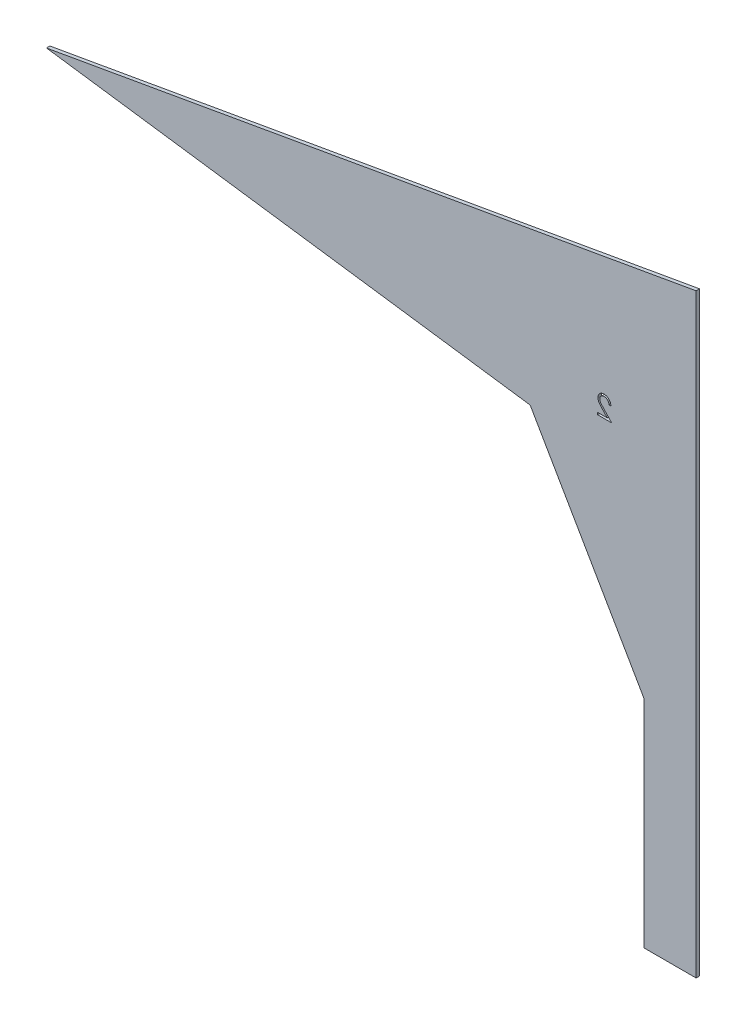
ISO-10303-21;
HEADER;
FILE_DESCRIPTION(('STEP AP214'),'2;1');
FILE_NAME('part.step','',(''),(''),'','','');
FILE_SCHEMA(('AUTOMOTIVE_DESIGN { 1 0 10303 214 1 1 1 1 }'));
ENDSEC;
DATA;
#1=APPLICATION_CONTEXT('core data for automotive mechanical design processes');
#2=APPLICATION_PROTOCOL_DEFINITION('international standard','automotive_design',2000,#1);
#3=PRODUCT_CONTEXT('',#1,'mechanical');
#4=PRODUCT('Part','Part','',(#3));
#5=PRODUCT_RELATED_PRODUCT_CATEGORY('part','',(#4));
#6=PRODUCT_DEFINITION_FORMATION('','',#4);
#7=PRODUCT_DEFINITION_CONTEXT('part definition',#1,'design');
#8=PRODUCT_DEFINITION('design','',#6,#7);
#9=PRODUCT_DEFINITION_SHAPE('','',#8);
#10=(LENGTH_UNIT() NAMED_UNIT(*) SI_UNIT(.MILLI.,.METRE.));
#11=(NAMED_UNIT(*) PLANE_ANGLE_UNIT() SI_UNIT($,.RADIAN.));
#12=(NAMED_UNIT(*) SI_UNIT($,.STERADIAN.) SOLID_ANGLE_UNIT());
#13=UNCERTAINTY_MEASURE_WITH_UNIT(LENGTH_MEASURE(1.E-05),#10,'distance_accuracy_value','');
#14=(GEOMETRIC_REPRESENTATION_CONTEXT(3) GLOBAL_UNCERTAINTY_ASSIGNED_CONTEXT((#13)) GLOBAL_UNIT_ASSIGNED_CONTEXT((#10,
#11,#12)) REPRESENTATION_CONTEXT('',''));
#15=CARTESIAN_POINT('',(0.,0.,0.));
#16=DIRECTION('',(0.,0.,1.));
#17=DIRECTION('',(1.,0.,0.));
#18=AXIS2_PLACEMENT_3D('',#15,#16,#17);
#19=CARTESIAN_POINT('',(-30.4074432347773,218.44830431483,-701.675));
#20=CARTESIAN_POINT('',(-30.418585596149,218.675113003966,-701.675));
#21=CARTESIAN_POINT('',(-30.4404688973478,219.120559233295,-701.675));
#22=CARTESIAN_POINT('',(-30.5429485860438,219.770022209553,-701.675));
#23=CARTESIAN_POINT('',(-30.6895839319732,220.39080618547,-701.675));
#24=CARTESIAN_POINT('',(-30.8969102745395,220.977926717219,-701.675));
#25=CARTESIAN_POINT('',(-31.1543915864007,221.536575082287,-701.675));
#26=CARTESIAN_POINT('',(-31.4631650211452,222.06453231055,-701.675));
#27=CARTESIAN_POINT('',(-31.8288915503683,222.559784351982,-701.675));
#28=CARTESIAN_POINT('',(-32.2436739171012,223.017740056204,-701.675));
#29=CARTESIAN_POINT('',(-32.6941717953863,223.43786097727,-701.675));
#30=CARTESIAN_POINT('',(-33.1802512659359,223.800655941686,-701.675));
#31=CARTESIAN_POINT('',(-33.6910363430227,224.107184981527,-701.675));
#32=CARTESIAN_POINT('',(-34.2249773573915,224.363441454883,-701.675));
#33=CARTESIAN_POINT('',(-34.7880984247651,224.55579118769,-701.675));
#34=CARTESIAN_POINT('',(-35.3752894081484,224.698511826109,-701.675));
#35=CARTESIAN_POINT('',(-35.9891301363198,224.784380222108,-701.675));
#36=CARTESIAN_POINT('',(-36.4073593991752,224.793610140897,-701.675));
#37=CARTESIAN_POINT('',(-36.620063427085,224.79830431483,-701.675));
#38=B_SPLINE_CURVE_WITH_KNOTS('',3,(#19,#20,#21,#22,#23,#24,#25,#26,#27,#28,#29,#30,#31,#32,#33,
#34,#35,#36,#37),.UNSPECIFIED.,.F.,.F.,(4,1,1,1,1,1,1,1,1,1,1,1,1,1,1,1,4),(0.,
0.0687907943906173,0.135103289431127,0.198978674310652,0.261904299780856,0.323494969367969,
0.385195377966051,0.446969238740774,0.509764776703132,0.572250568847369,0.633405175661153,
0.693251162921752,0.75258316278567,0.812579266153421,0.873275084920192,0.93554994289503,1.),.UNSPECIFIED.);
#39=DIRECTION('',(0.,0.,1.));
#40=VECTOR('',#39,1.);
#41=SURFACE_OF_LINEAR_EXTRUSION('',#38,#40);
#42=DIRECTION('',(0.,0.,-1.));
#43=VECTOR('',#42,1.);
#44=CARTESIAN_POINT('',(-30.4074432347773,218.44830431483,-701.675));
#45=LINE('',#44,#43);
#46=CARTESIAN_POINT('',(-30.4074432347773,218.44830431483,-698.5));
#47=VERTEX_POINT('',#46);
#48=CARTESIAN_POINT('',(-30.4074432347773,218.44830431483,-701.675));
#49=VERTEX_POINT('',#48);
#50=EDGE_CURVE('E11',#47,#49,#45,.T.);
#51=ORIENTED_EDGE('',*,*,#50,.F.);
#52=CARTESIAN_POINT('',(-30.4074432347773,218.44830431483,-698.5));
#53=CARTESIAN_POINT('',(-30.418585596149,218.675113003966,-698.5));
#54=CARTESIAN_POINT('',(-30.4404688973478,219.120559233295,-698.5));
#55=CARTESIAN_POINT('',(-30.5429485860438,219.770022209553,-698.5));
#56=CARTESIAN_POINT('',(-30.6895839319732,220.39080618547,-698.5));
#57=CARTESIAN_POINT('',(-30.8969102745395,220.977926717219,-698.5));
#58=CARTESIAN_POINT('',(-31.1543915864007,221.536575082287,-698.5));
#59=CARTESIAN_POINT('',(-31.4631650211452,222.06453231055,-698.5));
#60=CARTESIAN_POINT('',(-31.8288915503683,222.559784351982,-698.5));
#61=CARTESIAN_POINT('',(-32.2436739171012,223.017740056204,-698.5));
#62=CARTESIAN_POINT('',(-32.6941717953863,223.43786097727,-698.5));
#63=CARTESIAN_POINT('',(-33.1802512659359,223.800655941686,-698.5));
#64=CARTESIAN_POINT('',(-33.6910363430227,224.107184981527,-698.5));
#65=CARTESIAN_POINT('',(-34.2249773573915,224.363441454883,-698.5));
#66=CARTESIAN_POINT('',(-34.7880984247651,224.55579118769,-698.5));
#67=CARTESIAN_POINT('',(-35.3752894081484,224.698511826109,-698.5));
#68=CARTESIAN_POINT('',(-35.9891301363198,224.784380222108,-698.5));
#69=CARTESIAN_POINT('',(-36.4073593991752,224.793610140897,-698.5));
#70=CARTESIAN_POINT('',(-36.620063427085,224.79830431483,-698.5));
#71=B_SPLINE_CURVE_WITH_KNOTS('',3,(#52,#53,#54,#55,#56,#57,#58,#59,#60,#61,#62,#63,#64,#65,#66,
#67,#68,#69,#70),.UNSPECIFIED.,.F.,.F.,(4,1,1,1,1,1,1,1,1,1,1,1,1,1,1,1,4),(0.,
0.0687907943906173,0.135103289431127,0.198978674310652,0.261904299780856,0.323494969367969,
0.385195377966051,0.446969238740774,0.509764776703132,0.572250568847369,0.633405175661153,
0.693251162921752,0.75258316278567,0.812579266153421,0.873275084920192,0.93554994289503,1.),.UNSPECIFIED.);
#72=CARTESIAN_POINT('',(-36.620063427085,224.79830431483,-698.5));
#73=VERTEX_POINT('',#72);
#74=EDGE_CURVE('E151',#47,#73,#71,.T.);
#75=ORIENTED_EDGE('',*,*,#74,.T.);
#76=DIRECTION('',(0.,0.,-1.));
#77=VECTOR('',#76,1.);
#78=CARTESIAN_POINT('',(-36.620063427085,224.79830431483,-701.675));
#79=LINE('',#78,#77);
#80=CARTESIAN_POINT('',(-36.620063427085,224.79830431483,-701.675));
#81=VERTEX_POINT('',#80);
#82=EDGE_CURVE('E62',#73,#81,#79,.T.);
#83=ORIENTED_EDGE('',*,*,#82,.T.);
#84=EDGE_CURVE('E296',#49,#81,#38,.T.);
#85=ORIENTED_EDGE('',*,*,#84,.F.);
#86=EDGE_LOOP('',(#51,#75,#83,#85));
#87=FACE_BOUND('',#86,.T.);
#88=ADVANCED_FACE('F51',(#87),#41,.F.);
#89=CARTESIAN_POINT('',(-36.620063427085,224.79830431483,-701.675));
#90=CARTESIAN_POINT('',(-36.8289498017604,224.793414144749,-701.675));
#91=CARTESIAN_POINT('',(-37.2394040662474,224.783805135223,-701.675));
#92=CARTESIAN_POINT('',(-37.8384558877696,224.701285818783,-701.675));
#93=CARTESIAN_POINT('',(-38.4087437333488,224.572041955739,-701.675));
#94=CARTESIAN_POINT('',(-38.9491528625609,224.390710904091,-701.675));
#95=CARTESIAN_POINT('',(-39.4553715854415,224.146955663569,-701.675));
#96=CARTESIAN_POINT('',(-39.9312027279554,223.854143346015,-701.675));
#97=CARTESIAN_POINT('',(-40.382311140975,223.515489692404,-701.675));
#98=CARTESIAN_POINT('',(-40.788385206064,223.116779650635,-701.675));
#99=CARTESIAN_POINT('',(-41.1612648944785,222.691135243732,-701.675));
#100=CARTESIAN_POINT('',(-41.4829500260495,222.236722511214,-701.675));
#101=CARTESIAN_POINT('',(-41.7584302443829,221.767388827537,-701.675));
#102=CARTESIAN_POINT('',(-41.9880517591647,221.279555330357,-701.675));
#103=CARTESIAN_POINT('',(-42.1570858868191,220.768628732854,-701.675));
#104=CARTESIAN_POINT('',(-42.2854187048075,220.242047529088,-701.675));
#105=CARTESIAN_POINT('',(-42.3579579135956,219.694361057752,-701.675));
#106=CARTESIAN_POINT('',(-42.3690908614911,219.32366680487,-701.675));
#107=CARTESIAN_POINT('',(-42.374750927085,219.135203353292,-701.675));
#108=B_SPLINE_CURVE_WITH_KNOTS('',3,(#89,#90,#91,#92,#93,#94,#95,#96,#97,#98,#99,#100,#101,#102,
#103,#104,#105,#106,#107),.UNSPECIFIED.,.F.,.F.,(4,1,1,1,1,1,1,1,1,1,1,1,1,1,1,1,4),(0.,
0.0694754602496707,0.136516797617799,0.200788823609261,0.263829672855826,0.32573502296542,
0.38729069221529,0.449509218762602,0.512967819545442,0.57627521549306,0.637580100263924,
0.697902605917102,0.757172088426984,0.816598528488654,0.876653170892819,0.93728964241024,1.),.UNSPECIFIED.);
#109=DIRECTION('',(0.,0.,1.));
#110=VECTOR('',#109,1.);
#111=SURFACE_OF_LINEAR_EXTRUSION('',#108,#110);
#112=ORIENTED_EDGE('',*,*,#82,.F.);
#113=CARTESIAN_POINT('',(-36.620063427085,224.79830431483,-698.5));
#114=CARTESIAN_POINT('',(-36.8289498017604,224.793414144749,-698.5));
#115=CARTESIAN_POINT('',(-37.2394040662474,224.783805135223,-698.5));
#116=CARTESIAN_POINT('',(-37.8384558877696,224.701285818783,-698.5));
#117=CARTESIAN_POINT('',(-38.4087437333488,224.572041955739,-698.5));
#118=CARTESIAN_POINT('',(-38.9491528625609,224.390710904091,-698.5));
#119=CARTESIAN_POINT('',(-39.4553715854415,224.146955663569,-698.5));
#120=CARTESIAN_POINT('',(-39.9312027279554,223.854143346015,-698.5));
#121=CARTESIAN_POINT('',(-40.382311140975,223.515489692404,-698.5));
#122=CARTESIAN_POINT('',(-40.788385206064,223.116779650635,-698.5));
#123=CARTESIAN_POINT('',(-41.1612648944785,222.691135243732,-698.5));
#124=CARTESIAN_POINT('',(-41.4829500260495,222.236722511214,-698.5));
#125=CARTESIAN_POINT('',(-41.7584302443829,221.767388827537,-698.5));
#126=CARTESIAN_POINT('',(-41.9880517591647,221.279555330357,-698.5));
#127=CARTESIAN_POINT('',(-42.1570858868191,220.768628732854,-698.5));
#128=CARTESIAN_POINT('',(-42.2854187048075,220.242047529088,-698.5));
#129=CARTESIAN_POINT('',(-42.3579579135956,219.694361057752,-698.5));
#130=CARTESIAN_POINT('',(-42.3690908614911,219.32366680487,-698.5));
#131=CARTESIAN_POINT('',(-42.374750927085,219.135203353292,-698.5));
#132=B_SPLINE_CURVE_WITH_KNOTS('',3,(#113,#114,#115,#116,#117,#118,#119,#120,#121,#122,#123,
#124,#125,#126,#127,#128,#129,#130,#131),.UNSPECIFIED.,.F.,.F.,(4,1,1,1,1,1,1,1,1,1,1,1,1,1,1,1,
4),(0.,0.0694754602496707,0.136516797617799,0.200788823609261,0.263829672855826,
0.32573502296542,0.38729069221529,0.449509218762602,0.512967819545442,0.57627521549306,
0.637580100263924,0.697902605917102,0.757172088426984,0.816598528488654,0.876653170892819,
0.93728964241024,1.),.UNSPECIFIED.);
#133=CARTESIAN_POINT('',(-42.374750927085,219.135203353292,-698.5));
#134=VERTEX_POINT('',#133);
#135=EDGE_CURVE('E215',#73,#134,#132,.T.);
#136=ORIENTED_EDGE('',*,*,#135,.T.);
#137=DIRECTION('',(0.,0.,-1.));
#138=VECTOR('',#137,1.);
#139=CARTESIAN_POINT('',(-42.374750927085,219.135203353292,-701.675));
#140=LINE('',#139,#138);
#141=CARTESIAN_POINT('',(-42.374750927085,219.135203353292,-701.675));
#142=VERTEX_POINT('',#141);
#143=EDGE_CURVE('E287',#134,#142,#140,.T.);
#144=ORIENTED_EDGE('',*,*,#143,.T.);
#145=EDGE_CURVE('E305',#81,#142,#108,.T.);
#146=ORIENTED_EDGE('',*,*,#145,.F.);
#147=EDGE_LOOP('',(#112,#136,#144,#146));
#148=FACE_BOUND('',#147,.T.);
#149=ADVANCED_FACE('F309',(#148),#111,.F.);
#150=CARTESIAN_POINT('',(-42.374750927085,219.135203353292,-701.675));
#151=CARTESIAN_POINT('',(-42.3655347392519,218.869875853677,-701.675));
#152=CARTESIAN_POINT('',(-42.3472640946337,218.343876976413,-701.675));
#153=CARTESIAN_POINT('',(-42.190975845031,217.570910366307,-701.675));
#154=CARTESIAN_POINT('',(-41.946882691783,216.822009042421,-701.675));
#155=CARTESIAN_POINT('',(-41.6529827923601,216.21928172679,-701.675));
#156=CARTESIAN_POINT('',(-41.3564970611101,215.733596567913,-701.675));
#157=CARTESIAN_POINT('',(-41.0893207697789,215.333716902564,-701.675));
#158=CARTESIAN_POINT('',(-40.7765480126459,214.903157138901,-701.675));
#159=CARTESIAN_POINT('',(-40.4136264737348,214.443359059766,-701.675));
#160=CARTESIAN_POINT('',(-40.0080635553143,213.950721133444,-701.675));
#161=CARTESIAN_POINT('',(-39.5561857804732,213.425540961347,-701.675));
#162=CARTESIAN_POINT('',(-39.0547708283282,212.873244614183,-701.675));
#163=CARTESIAN_POINT('',(-38.702843845651,212.496024126629,-701.675));
#164=CARTESIAN_POINT('',(-38.5204841001619,212.300557920599,-701.675));
#165=B_SPLINE_CURVE_WITH_KNOTS('',3,(#150,#151,#152,#153,#154,#155,#156,#157,#158,#159,#160,
#161,#162,#163,#164),.UNSPECIFIED.,.F.,.F.,(4,1,1,1,1,1,1,1,1,1,1,1,4),(0.,0.0987021963061504,
0.195672308810662,0.292422426507954,0.391342543799823,0.44446244067189,0.504228775449315,
0.570352337994677,0.642545753097748,0.722287505344017,0.807921122682712,0.900469537985015,1.),.UNSPECIFIED.);
#166=DIRECTION('',(0.,0.,1.));
#167=VECTOR('',#166,1.);
#168=SURFACE_OF_LINEAR_EXTRUSION('',#165,#167);
#169=ORIENTED_EDGE('',*,*,#143,.F.);
#170=CARTESIAN_POINT('',(-42.374750927085,219.135203353292,-698.5));
#171=CARTESIAN_POINT('',(-42.3655347392519,218.869875853677,-698.5));
#172=CARTESIAN_POINT('',(-42.3472640946337,218.343876976413,-698.5));
#173=CARTESIAN_POINT('',(-42.190975845031,217.570910366307,-698.5));
#174=CARTESIAN_POINT('',(-41.946882691783,216.822009042421,-698.5));
#175=CARTESIAN_POINT('',(-41.6529827923601,216.21928172679,-698.5));
#176=CARTESIAN_POINT('',(-41.3564970611101,215.733596567913,-698.5));
#177=CARTESIAN_POINT('',(-41.0893207697789,215.333716902564,-698.5));
#178=CARTESIAN_POINT('',(-40.7765480126459,214.903157138901,-698.5));
#179=CARTESIAN_POINT('',(-40.4136264737348,214.443359059766,-698.5));
#180=CARTESIAN_POINT('',(-40.0080635553143,213.950721133444,-698.5));
#181=CARTESIAN_POINT('',(-39.5561857804732,213.425540961347,-698.5));
#182=CARTESIAN_POINT('',(-39.0547708283282,212.873244614183,-698.5));
#183=CARTESIAN_POINT('',(-38.702843845651,212.496024126629,-698.5));
#184=CARTESIAN_POINT('',(-38.5204841001619,212.300557920599,-698.5));
#185=B_SPLINE_CURVE_WITH_KNOTS('',3,(#170,#171,#172,#173,#174,#175,#176,#177,#178,#179,#180,
#181,#182,#183,#184),.UNSPECIFIED.,.F.,.F.,(4,1,1,1,1,1,1,1,1,1,1,1,4),(0.,0.0987021963061504,
0.195672308810662,0.292422426507954,0.391342543799823,0.44446244067189,0.504228775449315,
0.570352337994677,0.642545753097748,0.722287505344017,0.807921122682712,0.900469537985015,1.),.UNSPECIFIED.);
#186=CARTESIAN_POINT('',(-38.5204841001619,212.300557920599,-698.5));
#187=VERTEX_POINT('',#186);
#188=EDGE_CURVE('E209',#134,#187,#185,.T.);
#189=ORIENTED_EDGE('',*,*,#188,.T.);
#190=DIRECTION('',(0.,0.,-1.));
#191=VECTOR('',#190,1.);
#192=CARTESIAN_POINT('',(-38.5204841001619,212.300557920599,-701.675));
#193=LINE('',#192,#191);
#194=CARTESIAN_POINT('',(-38.5204841001619,212.300557920599,-701.675));
#195=VERTEX_POINT('',#194);
#196=EDGE_CURVE('E283',#187,#195,#193,.T.);
#197=ORIENTED_EDGE('',*,*,#196,.T.);
#198=EDGE_CURVE('E311',#142,#195,#165,.T.);
#199=ORIENTED_EDGE('',*,*,#198,.F.);
#200=EDGE_LOOP('',(#169,#189,#197,#199));
#201=FACE_BOUND('',#200,.T.);
#202=ADVANCED_FACE('F333',(#201),#168,.F.);
#203=CARTESIAN_POINT('',(-38.5204841001619,212.300557920599,-701.675));
#204=DIRECTION('',(-0.729724964678344,-0.683740795861406,0.));
#205=DIRECTION('',(0.683740795861406,-0.729724964678344,0.));
#206=AXIS2_PLACEMENT_3D('',#203,#204,#205);
#207=PLANE('',#206);
#208=ORIENTED_EDGE('',*,*,#196,.F.);
#209=DIRECTION('',(0.683740795861406,-0.729724964678344,0.));
#210=VECTOR('',#209,1.);
#211=CARTESIAN_POINT('',(-38.5204841001619,212.300557920599,-698.5));
#212=LINE('',#211,#210);
#213=CARTESIAN_POINT('',(-33.7541679943927,207.213688930215,-698.5));
#214=VERTEX_POINT('',#213);
#215=EDGE_CURVE('E205',#187,#214,#212,.T.);
#216=ORIENTED_EDGE('',*,*,#215,.T.);
#217=DIRECTION('',(0.,0.,-1.));
#218=VECTOR('',#217,1.);
#219=CARTESIAN_POINT('',(-33.7541679943927,207.213688930215,-701.675));
#220=LINE('',#219,#218);
#221=CARTESIAN_POINT('',(-33.7541679943927,207.213688930215,-701.675));
#222=VERTEX_POINT('',#221);
#223=EDGE_CURVE('E279',#214,#222,#220,.T.);
#224=ORIENTED_EDGE('',*,*,#223,.T.);
#225=DIRECTION('',(0.683740795861406,-0.729724964678344,0.));
#226=VECTOR('',#225,1.);
#227=CARTESIAN_POINT('',(-38.5204841001619,212.300557920599,-701.675));
#228=LINE('',#227,#226);
#229=EDGE_CURVE('E314',#195,#222,#228,.T.);
#230=ORIENTED_EDGE('',*,*,#229,.F.);
#231=EDGE_LOOP('',(#208,#216,#224,#230));
#232=FACE_BOUND('',#231,.T.);
#233=ADVANCED_FACE('F354',(#232),#207,.F.);
#234=CARTESIAN_POINT('',(-33.7541679943927,207.213688930215,-701.675));
#235=DIRECTION('',(0.,1.,0.));
#236=DIRECTION('',(-1.,0.,0.));
#237=AXIS2_PLACEMENT_3D('',#234,#235,#236);
#238=PLANE('',#237);
#239=ORIENTED_EDGE('',*,*,#223,.F.);
#240=DIRECTION('',(1.,0.,0.));
#241=VECTOR('',#240,1.);
#242=CARTESIAN_POINT('',(0.,207.213688930215,-698.5));
#243=LINE('',#242,#241);
#244=CARTESIAN_POINT('',(-42.6189816963158,207.213688930215,-698.5));
#245=VERTEX_POINT('',#244);
#246=EDGE_CURVE('E201',#214,#245,#243,.F.);
#247=ORIENTED_EDGE('',*,*,#246,.T.);
#248=DIRECTION('',(0.,0.,-1.));
#249=VECTOR('',#248,1.);
#250=CARTESIAN_POINT('',(-42.6189816963158,207.213688930215,-701.675));
#251=LINE('',#250,#249);
#252=CARTESIAN_POINT('',(-42.6189816963158,207.213688930215,-701.675));
#253=VERTEX_POINT('',#252);
#254=EDGE_CURVE('E275',#245,#253,#251,.T.);
#255=ORIENTED_EDGE('',*,*,#254,.T.);
#256=DIRECTION('',(-1.,0.,0.));
#257=VECTOR('',#256,1.);
#258=CARTESIAN_POINT('',(-33.7541679943927,207.213688930215,-701.675));
#259=LINE('',#258,#257);
#260=EDGE_CURVE('E620',#222,#253,#259,.T.);
#261=ORIENTED_EDGE('',*,*,#260,.F.);
#262=EDGE_LOOP('',(#239,#247,#255,#261));
#263=FACE_BOUND('',#262,.T.);
#264=ADVANCED_FACE('F362',(#263),#238,.F.);
#265=CARTESIAN_POINT('',(-42.6189816963158,207.213688930215,-701.675));
#266=DIRECTION('',(-1.,0.,0.));
#267=DIRECTION('',(0.,-1.,0.));
#268=AXIS2_PLACEMENT_3D('',#265,#266,#267);
#269=PLANE('',#268);
#270=ORIENTED_EDGE('',*,*,#254,.F.);
#271=DIRECTION('',(0.,1.,0.));
#272=VECTOR('',#271,1.);
#273=CARTESIAN_POINT('',(-42.6189816963158,0.,-698.5));
#274=LINE('',#273,#272);
#275=CARTESIAN_POINT('',(-42.6189816963158,205.259842776369,-698.5));
#276=VERTEX_POINT('',#275);
#277=EDGE_CURVE('E197',#245,#276,#274,.F.);
#278=ORIENTED_EDGE('',*,*,#277,.T.);
#279=DIRECTION('',(0.,0.,-1.));
#280=VECTOR('',#279,1.);
#281=CARTESIAN_POINT('',(-42.6189816963158,205.259842776369,-701.675));
#282=LINE('',#281,#280);
#283=CARTESIAN_POINT('',(-42.6189816963158,205.259842776369,-701.675));
#284=VERTEX_POINT('',#283);
#285=EDGE_CURVE('E271',#276,#284,#282,.T.);
#286=ORIENTED_EDGE('',*,*,#285,.T.);
#287=DIRECTION('',(0.,-1.,0.));
#288=VECTOR('',#287,1.);
#289=CARTESIAN_POINT('',(-42.6189816963158,207.213688930215,-701.675));
#290=LINE('',#289,#288);
#291=EDGE_CURVE('E617',#253,#284,#290,.T.);
#292=ORIENTED_EDGE('',*,*,#291,.F.);
#293=EDGE_LOOP('',(#270,#278,#286,#292));
#294=FACE_BOUND('',#293,.T.);
#295=ADVANCED_FACE('F370',(#294),#269,.F.);
#296=CARTESIAN_POINT('',(-42.6189816963158,205.259842776369,-701.675));
#297=DIRECTION('',(0.,-1.,0.));
#298=DIRECTION('',(1.,0.,0.));
#299=AXIS2_PLACEMENT_3D('',#296,#297,#298);
#300=PLANE('',#299);
#301=ORIENTED_EDGE('',*,*,#285,.F.);
#302=DIRECTION('',(1.,0.,0.));
#303=VECTOR('',#302,1.);
#304=CARTESIAN_POINT('',(0.,205.259842776369,-698.5));
#305=LINE('',#304,#303);
#306=CARTESIAN_POINT('',(-29.674750927085,205.259842776369,-698.5));
#307=VERTEX_POINT('',#306);
#308=EDGE_CURVE('E193',#276,#307,#305,.T.);
#309=ORIENTED_EDGE('',*,*,#308,.T.);
#310=DIRECTION('',(0.,0.,-1.));
#311=VECTOR('',#310,1.);
#312=CARTESIAN_POINT('',(-29.674750927085,205.259842776369,-701.675));
#313=LINE('',#312,#311);
#314=CARTESIAN_POINT('',(-29.674750927085,205.259842776369,-701.675));
#315=VERTEX_POINT('',#314);
#316=EDGE_CURVE('E267',#307,#315,#313,.T.);
#317=ORIENTED_EDGE('',*,*,#316,.T.);
#318=DIRECTION('',(1.,0.,0.));
#319=VECTOR('',#318,1.);
#320=CARTESIAN_POINT('',(-42.6189816963158,205.259842776369,-701.675));
#321=LINE('',#320,#319);
#322=EDGE_CURVE('E574',#284,#315,#321,.T.);
#323=ORIENTED_EDGE('',*,*,#322,.F.);
#324=EDGE_LOOP('',(#301,#309,#317,#323));
#325=FACE_BOUND('',#324,.T.);
#326=ADVANCED_FACE('F379',(#325),#300,.F.);
#327=CARTESIAN_POINT('',(-29.674750927085,205.259842776369,-701.675));
#328=DIRECTION('',(0.729691385153424,0.683776631973393,0.));
#329=DIRECTION('',(-0.683776631973393,0.729691385153424,0.));
#330=AXIS2_PLACEMENT_3D('',#327,#328,#329);
#331=PLANE('',#330);
#332=ORIENTED_EDGE('',*,*,#316,.F.);
#333=DIRECTION('',(-0.683776631973393,0.729691385153424,0.));
#334=VECTOR('',#333,1.);
#335=CARTESIAN_POINT('',(-29.674750927085,205.259842776369,-698.5));
#336=LINE('',#335,#334);
#337=CARTESIAN_POINT('',(-37.0627316963158,213.143917295599,-698.5));
#338=VERTEX_POINT('',#337);
#339=EDGE_CURVE('E186',#307,#338,#336,.T.);
#340=ORIENTED_EDGE('',*,*,#339,.T.);
#341=DIRECTION('',(0.,0.,-1.));
#342=VECTOR('',#341,1.);
#343=CARTESIAN_POINT('',(-37.0627316963158,213.143917295599,-701.675));
#344=LINE('',#343,#342);
#345=CARTESIAN_POINT('',(-37.0627316963158,213.143917295599,-701.675));
#346=VERTEX_POINT('',#345);
#347=EDGE_CURVE('E263',#338,#346,#344,.T.);
#348=ORIENTED_EDGE('',*,*,#347,.T.);
#349=DIRECTION('',(-0.683776631973393,0.729691385153424,0.));
#350=VECTOR('',#349,1.);
#351=CARTESIAN_POINT('',(-29.674750927085,205.259842776369,-701.675));
#352=LINE('',#351,#350);
#353=EDGE_CURVE('E564',#315,#346,#352,.T.);
#354=ORIENTED_EDGE('',*,*,#353,.F.);
#355=EDGE_LOOP('',(#332,#340,#348,#354));
#356=FACE_BOUND('',#355,.T.);
#357=ADVANCED_FACE('F388',(#356),#331,.F.);
#358=CARTESIAN_POINT('',(-37.0627316963158,213.143917295599,-701.675));
#359=CARTESIAN_POINT('',(-37.2426066230842,213.331686649814,-701.675));
#360=CARTESIAN_POINT('',(-37.5881095449743,213.692353151188,-701.675));
#361=CARTESIAN_POINT('',(-38.0767832844644,214.218911262775,-701.675));
#362=CARTESIAN_POINT('',(-38.5156897779933,214.707405191726,-701.675));
#363=CARTESIAN_POINT('',(-38.9076701586514,215.156911976831,-701.675));
#364=CARTESIAN_POINT('',(-39.2442210949996,215.574006652975,-701.675));
#365=CARTESIAN_POINT('',(-39.5428828146011,215.945180682502,-701.675000000001));
#366=CARTESIAN_POINT('',(-39.7821812455178,216.286744190607,-701.675));
#367=CARTESIAN_POINT('',(-40.0418893277607,216.682660960617,-701.675));
#368=CARTESIAN_POINT('',(-40.2934254265139,217.166053715521,-701.675));
#369=CARTESIAN_POINT('',(-40.509574107248,217.756787081356,-701.675));
#370=CARTESIAN_POINT('',(-40.6413720680898,218.364902556635,-701.675));
#371=CARTESIAN_POINT('',(-40.6571826727715,218.775849358278,-701.675));
#372=CARTESIAN_POINT('',(-40.6651355424696,218.982559122522,-701.675));
#373=B_SPLINE_CURVE_WITH_KNOTS('',3,(#358,#359,#360,#361,#362,#363,#364,#365,#366,#367,#368,
#369,#370,#371,#372),.UNSPECIFIED.,.F.,.F.,(4,1,1,1,1,1,1,1,1,1,1,1,4),(0.,0.110802643801319,
0.212829202347771,0.306101309823113,0.39064732111601,0.466924469360852,0.53448103928403,
0.593586940965673,0.644557004508716,0.736200452629372,0.825024025618863,0.911985584829759,1.),.UNSPECIFIED.);
#374=DIRECTION('',(0.,0.,1.));
#375=VECTOR('',#374,1.);
#376=SURFACE_OF_LINEAR_EXTRUSION('',#373,#375);
#377=ORIENTED_EDGE('',*,*,#347,.F.);
#378=CARTESIAN_POINT('',(-37.0627316963158,213.143917295599,-698.5));
#379=CARTESIAN_POINT('',(-37.2426066230842,213.331686649814,-698.5));
#380=CARTESIAN_POINT('',(-37.5881095449743,213.692353151188,-698.5));
#381=CARTESIAN_POINT('',(-38.0767832844644,214.218911262775,-698.5));
#382=CARTESIAN_POINT('',(-38.5156897779933,214.707405191726,-698.5));
#383=CARTESIAN_POINT('',(-38.9076701586514,215.156911976831,-698.5));
#384=CARTESIAN_POINT('',(-39.2442210949996,215.574006652975,-698.5));
#385=CARTESIAN_POINT('',(-39.5428828146011,215.945180682502,-698.5));
#386=CARTESIAN_POINT('',(-39.7821812455178,216.286744190607,-698.5));
#387=CARTESIAN_POINT('',(-40.0418893277607,216.682660960617,-698.5));
#388=CARTESIAN_POINT('',(-40.2934254265139,217.166053715521,-698.5));
#389=CARTESIAN_POINT('',(-40.509574107248,217.756787081356,-698.5));
#390=CARTESIAN_POINT('',(-40.6413720680898,218.364902556635,-698.5));
#391=CARTESIAN_POINT('',(-40.6571826727715,218.775849358278,-698.5));
#392=CARTESIAN_POINT('',(-40.6651355424696,218.982559122522,-698.5));
#393=B_SPLINE_CURVE_WITH_KNOTS('',3,(#378,#379,#380,#381,#382,#383,#384,#385,#386,#387,#388,
#389,#390,#391,#392),.UNSPECIFIED.,.F.,.F.,(4,1,1,1,1,1,1,1,1,1,1,1,4),(0.,0.110802643801319,
0.212829202347771,0.306101309823113,0.39064732111601,0.466924469360852,0.53448103928403,
0.593586940965673,0.644557004508716,0.736200452629372,0.825024025618863,0.911985584829759,1.),.UNSPECIFIED.);
#394=CARTESIAN_POINT('',(-40.6651355424696,218.982559122522,-698.5));
#395=VERTEX_POINT('',#394);
#396=EDGE_CURVE('E177',#338,#395,#393,.T.);
#397=ORIENTED_EDGE('',*,*,#396,.T.);
#398=DIRECTION('',(0.,0.,-1.));
#399=VECTOR('',#398,1.);
#400=CARTESIAN_POINT('',(-40.6651355424696,218.982559122522,-701.675));
#401=LINE('',#400,#399);
#402=CARTESIAN_POINT('',(-40.6651355424696,218.982559122522,-701.675));
#403=VERTEX_POINT('',#402);
#404=EDGE_CURVE('E260',#395,#403,#401,.T.);
#405=ORIENTED_EDGE('',*,*,#404,.T.);
#406=EDGE_CURVE('E571',#346,#403,#373,.T.);
#407=ORIENTED_EDGE('',*,*,#406,.F.);
#408=EDGE_LOOP('',(#377,#397,#405,#407));
#409=FACE_BOUND('',#408,.T.);
#410=ADVANCED_FACE('F397',(#409),#376,.F.);
#411=CARTESIAN_POINT('',(-40.6651355424696,218.982559122522,-701.675));
#412=CARTESIAN_POINT('',(-40.6616752879542,219.112542162444,-701.675));
#413=CARTESIAN_POINT('',(-40.6548557907714,219.368713773696,-701.675));
#414=CARTESIAN_POINT('',(-40.5946703229837,219.744302262069,-701.675));
#415=CARTESIAN_POINT('',(-40.5037174255265,220.106605034409,-701.675));
#416=CARTESIAN_POINT('',(-40.3733868067227,220.456736518465,-701.675));
#417=CARTESIAN_POINT('',(-40.2013558356868,220.791176424711,-701.675));
#418=CARTESIAN_POINT('',(-39.9919507249925,221.110331852676,-701.675));
#419=CARTESIAN_POINT('',(-39.7503419512467,221.418881791837,-701.675));
#420=CARTESIAN_POINT('',(-39.4708443281743,221.708187599838,-701.675));
#421=CARTESIAN_POINT('',(-39.1638044846557,221.973152446822,-701.675));
#422=CARTESIAN_POINT('',(-38.8394414976275,222.207870683148,-701.675));
#423=CARTESIAN_POINT('',(-38.4962687872986,222.404026414782,-701.675));
#424=CARTESIAN_POINT('',(-38.1357332651701,222.564827449435,-701.675));
#425=CARTESIAN_POINT('',(-37.7588400673904,222.690967738518,-701.675));
#426=CARTESIAN_POINT('',(-37.3648602403671,222.778372292236,-701.675));
#427=CARTESIAN_POINT('',(-36.9548823803152,222.833249812002,-701.675));
#428=CARTESIAN_POINT('',(-36.6749372109133,222.840674804818,-701.675));
#429=CARTESIAN_POINT('',(-36.5322929943927,222.844458160984,-701.675));
#430=B_SPLINE_CURVE_WITH_KNOTS('',3,(#411,#412,#413,#414,#415,#416,#417,#418,#419,#420,#421,
#422,#423,#424,#425,#426,#427,#428,#429),.UNSPECIFIED.,.F.,.F.,(4,1,1,1,1,1,1,1,1,1,1,1,1,1,1,1,
4),(0.,0.0619654006870611,0.122121905638293,0.180988496849839,0.239933216451901,
0.299905831106522,0.359988847476987,0.421775741741646,0.486575826421125,0.55153480461974,
0.615017542759978,0.677258616661656,0.739729962362712,0.80305010266295,0.866495132015698,
0.931973474177148,1.),.UNSPECIFIED.);
#431=DIRECTION('',(0.,0.,1.));
#432=VECTOR('',#431,1.);
#433=SURFACE_OF_LINEAR_EXTRUSION('',#430,#432);
#434=ORIENTED_EDGE('',*,*,#404,.F.);
#435=CARTESIAN_POINT('',(-40.6651355424696,218.982559122522,-698.5));
#436=CARTESIAN_POINT('',(-40.6616752879542,219.112542162444,-698.5));
#437=CARTESIAN_POINT('',(-40.6548557907714,219.368713773696,-698.5));
#438=CARTESIAN_POINT('',(-40.5946703229837,219.744302262069,-698.5));
#439=CARTESIAN_POINT('',(-40.5037174255265,220.106605034409,-698.5));
#440=CARTESIAN_POINT('',(-40.3733868067227,220.456736518465,-698.5));
#441=CARTESIAN_POINT('',(-40.2013558356868,220.791176424711,-698.5));
#442=CARTESIAN_POINT('',(-39.9919507249925,221.110331852676,-698.5));
#443=CARTESIAN_POINT('',(-39.7503419512467,221.418881791837,-698.5));
#444=CARTESIAN_POINT('',(-39.4708443281743,221.708187599838,-698.5));
#445=CARTESIAN_POINT('',(-39.1638044846557,221.973152446822,-698.5));
#446=CARTESIAN_POINT('',(-38.8394414976275,222.207870683148,-698.5));
#447=CARTESIAN_POINT('',(-38.4962687872986,222.404026414782,-698.5));
#448=CARTESIAN_POINT('',(-38.1357332651701,222.564827449435,-698.5));
#449=CARTESIAN_POINT('',(-37.7588400673904,222.690967738518,-698.5));
#450=CARTESIAN_POINT('',(-37.3648602403671,222.778372292236,-698.5));
#451=CARTESIAN_POINT('',(-36.9548823803152,222.833249812002,-698.5));
#452=CARTESIAN_POINT('',(-36.6749372109133,222.840674804818,-698.5));
#453=CARTESIAN_POINT('',(-36.5322929943927,222.844458160984,-698.5));
#454=B_SPLINE_CURVE_WITH_KNOTS('',3,(#435,#436,#437,#438,#439,#440,#441,#442,#443,#444,#445,
#446,#447,#448,#449,#450,#451,#452,#453),.UNSPECIFIED.,.F.,.F.,(4,1,1,1,1,1,1,1,1,1,1,1,1,1,1,1,
4),(0.,0.0619654006870611,0.122121905638293,0.180988496849839,0.239933216451901,
0.299905831106522,0.359988847476987,0.421775741741646,0.486575826421125,0.55153480461974,
0.615017542759978,0.677258616661656,0.739729962362712,0.80305010266295,0.866495132015698,
0.931973474177148,1.),.UNSPECIFIED.);
#455=CARTESIAN_POINT('',(-36.5322929943927,222.844458160984,-698.5));
#456=VERTEX_POINT('',#455);
#457=EDGE_CURVE('E168',#395,#456,#454,.T.);
#458=ORIENTED_EDGE('',*,*,#457,.T.);
#459=DIRECTION('',(0.,0.,-1.));
#460=VECTOR('',#459,1.);
#461=CARTESIAN_POINT('',(-36.5322929943927,222.844458160984,-701.675));
#462=LINE('',#461,#460);
#463=CARTESIAN_POINT('',(-36.5322929943927,222.844458160984,-701.675));
#464=VERTEX_POINT('',#463);
#465=EDGE_CURVE('E70',#456,#464,#462,.T.);
#466=ORIENTED_EDGE('',*,*,#465,.T.);
#467=EDGE_CURVE('E257',#403,#464,#430,.T.);
#468=ORIENTED_EDGE('',*,*,#467,.F.);
#469=EDGE_LOOP('',(#434,#458,#466,#468));
#470=FACE_BOUND('',#469,.T.);
#471=ADVANCED_FACE('F406',(#470),#433,.F.);
#472=CARTESIAN_POINT('',(-36.5322929943927,222.844458160984,-701.675));
#473=CARTESIAN_POINT('',(-36.383317461819,222.840566342519,-701.675));
#474=CARTESIAN_POINT('',(-36.090754113824,222.832923453648,-701.675));
#475=CARTESIAN_POINT('',(-35.6612090916979,222.779460096777,-701.675));
#476=CARTESIAN_POINT('',(-35.2514393597466,222.687226308331,-701.675));
#477=CARTESIAN_POINT('',(-34.8604141451029,222.561078980596,-701.675));
#478=CARTESIAN_POINT('',(-34.4874718280365,222.40074030772,-701.675));
#479=CARTESIAN_POINT('',(-34.1344261026333,222.201032383111,-701.675));
#480=CARTESIAN_POINT('',(-33.8020695196615,221.962725084667,-701.675));
#481=CARTESIAN_POINT('',(-33.4897772997382,221.692538628103,-701.675));
#482=CARTESIAN_POINT('',(-33.2020462136923,221.391724970056,-701.675));
#483=CARTESIAN_POINT('',(-32.9492425036275,221.056390742506,-701.675));
#484=CARTESIAN_POINT('',(-32.7283495123601,220.692658667415,-701.675));
#485=CARTESIAN_POINT('',(-32.5356221129914,220.30151018503,-701.675));
#486=CARTESIAN_POINT('',(-32.3791089998266,219.879396039686,-701.675));
#487=CARTESIAN_POINT('',(-32.2595122810516,219.427814674725,-701.675));
#488=CARTESIAN_POINT('',(-32.1648781581812,218.948726870038,-701.675));
#489=CARTESIAN_POINT('',(-32.1332632103176,218.617882336748,-701.675));
#490=CARTESIAN_POINT('',(-32.1170586193927,218.44830431483,-701.675));
#491=B_SPLINE_CURVE_WITH_KNOTS('',3,(#472,#473,#474,#475,#476,#477,#478,#479,#480,#481,#482,
#483,#484,#485,#486,#487,#488,#489,#490),.UNSPECIFIED.,.F.,.F.,(4,1,1,1,1,1,1,1,1,1,1,1,1,1,1,1,
4),(0.,0.0644386715952429,0.126546911271677,0.18688715343657,0.245877535589455,
0.304040884691267,0.36219121807266,0.420975932791644,0.480660283279667,0.540600274953757,
0.600689098349454,0.661935789757197,0.724442505913983,0.789038393881743,0.856313757050996,
0.926352028205864,1.),.UNSPECIFIED.);
#492=DIRECTION('',(0.,0.,1.));
#493=VECTOR('',#492,1.);
#494=SURFACE_OF_LINEAR_EXTRUSION('',#491,#493);
#495=ORIENTED_EDGE('',*,*,#465,.F.);
#496=CARTESIAN_POINT('',(-36.5322929943927,222.844458160984,-698.5));
#497=CARTESIAN_POINT('',(-36.383317461819,222.840566342519,-698.5));
#498=CARTESIAN_POINT('',(-36.090754113824,222.832923453648,-698.5));
#499=CARTESIAN_POINT('',(-35.6612090916979,222.779460096777,-698.5));
#500=CARTESIAN_POINT('',(-35.2514393597466,222.687226308331,-698.5));
#501=CARTESIAN_POINT('',(-34.8604141451029,222.561078980596,-698.5));
#502=CARTESIAN_POINT('',(-34.4874718280365,222.40074030772,-698.5));
#503=CARTESIAN_POINT('',(-34.1344261026333,222.201032383111,-698.5));
#504=CARTESIAN_POINT('',(-33.8020695196615,221.962725084667,-698.5));
#505=CARTESIAN_POINT('',(-33.4897772997382,221.692538628103,-698.5));
#506=CARTESIAN_POINT('',(-33.2020462136923,221.391724970056,-698.5));
#507=CARTESIAN_POINT('',(-32.9492425036275,221.056390742506,-698.5));
#508=CARTESIAN_POINT('',(-32.7283495123601,220.692658667415,-698.5));
#509=CARTESIAN_POINT('',(-32.5356221129914,220.30151018503,-698.5));
#510=CARTESIAN_POINT('',(-32.3791089998266,219.879396039686,-698.5));
#511=CARTESIAN_POINT('',(-32.2595122810516,219.427814674725,-698.5));
#512=CARTESIAN_POINT('',(-32.1648781581812,218.948726870038,-698.5));
#513=CARTESIAN_POINT('',(-32.1332632103176,218.617882336748,-698.5));
#514=CARTESIAN_POINT('',(-32.1170586193927,218.44830431483,-698.5));
#515=B_SPLINE_CURVE_WITH_KNOTS('',3,(#496,#497,#498,#499,#500,#501,#502,#503,#504,#505,#506,
#507,#508,#509,#510,#511,#512,#513,#514),.UNSPECIFIED.,.F.,.F.,(4,1,1,1,1,1,1,1,1,1,1,1,1,1,1,1,
4),(0.,0.0644386715952429,0.126546911271677,0.18688715343657,0.245877535589455,
0.304040884691267,0.36219121807266,0.420975932791644,0.480660283279667,0.540600274953757,
0.600689098349454,0.661935789757197,0.724442505913983,0.789038393881743,0.856313757050996,
0.926352028205864,1.),.UNSPECIFIED.);
#516=CARTESIAN_POINT('',(-32.1170586193927,218.44830431483,-698.5));
#517=VERTEX_POINT('',#516);
#518=EDGE_CURVE('E149',#456,#517,#515,.T.);
#519=ORIENTED_EDGE('',*,*,#518,.T.);
#520=DIRECTION('',(0.,0.,-1.));
#521=VECTOR('',#520,1.);
#522=CARTESIAN_POINT('',(-32.1170586193927,218.44830431483,-701.675));
#523=LINE('',#522,#521);
#524=CARTESIAN_POINT('',(-32.1170586193927,218.44830431483,-701.675));
#525=VERTEX_POINT('',#524);
#526=EDGE_CURVE('E55',#517,#525,#523,.T.);
#527=ORIENTED_EDGE('',*,*,#526,.T.);
#528=EDGE_CURVE('E501',#464,#525,#491,.T.);
#529=ORIENTED_EDGE('',*,*,#528,.F.);
#530=EDGE_LOOP('',(#495,#519,#527,#529));
#531=FACE_BOUND('',#530,.T.);
#532=ADVANCED_FACE('F154',(#531),#494,.F.);
#533=CARTESIAN_POINT('',(-105.,181.865334794732,-701.675));
#534=DIRECTION('',(-0.137996515313345,-0.990432714403848,0.));
#535=DIRECTION('',(0.990432714403848,-0.137996515313345,0.));
#536=AXIS2_PLACEMENT_3D('',#533,#534,#535);
#537=PLANE('',#536);
#538=DIRECTION('',(0.,0.,-1.));
#539=VECTOR('',#538,1.);
#540=CARTESIAN_POINT('',(-105.,181.865334794732,-701.675));
#541=LINE('',#540,#539);
#542=CARTESIAN_POINT('',(-105.,181.865334794732,-698.5));
#543=VERTEX_POINT('',#542);
#544=CARTESIAN_POINT('',(-105.,181.865334794732,-701.675));
#545=VERTEX_POINT('',#544);
#546=EDGE_CURVE('E144',#543,#545,#541,.T.);
#547=ORIENTED_EDGE('',*,*,#546,.F.);
#548=DIRECTION('',(0.990432714403848,-0.137996515313345,0.));
#549=VECTOR('',#548,1.);
#550=CARTESIAN_POINT('',(-105.,181.865334794732,-698.5));
#551=LINE('',#550,#549);
#552=CARTESIAN_POINT('',(-551.988806236242,244.144070894237,-698.5));
#553=VERTEX_POINT('',#552);
#554=EDGE_CURVE('E603',#553,#543,#551,.T.);
#555=ORIENTED_EDGE('',*,*,#554,.F.);
#556=DIRECTION('',(0.,0.,-1.));
#557=VECTOR('',#556,1.);
#558=CARTESIAN_POINT('',(-551.988806236242,244.144070894237,-701.675));
#559=LINE('',#558,#557);
#560=CARTESIAN_POINT('',(-551.988806236242,244.144070894237,-701.675));
#561=VERTEX_POINT('',#560);
#562=EDGE_CURVE('E247',#553,#561,#559,.T.);
#563=ORIENTED_EDGE('',*,*,#562,.T.);
#564=DIRECTION('',(0.990432714403848,-0.137996515313345,0.));
#565=VECTOR('',#564,1.);
#566=CARTESIAN_POINT('',(-105.,181.865334794732,-701.675));
#567=LINE('',#566,#565);
#568=EDGE_CURVE('E522',#561,#545,#567,.T.);
#569=ORIENTED_EDGE('',*,*,#568,.T.);
#570=EDGE_LOOP('',(#547,#555,#563,#569));
#571=FACE_BOUND('',#570,.T.);
#572=ADVANCED_FACE('F422',(#571),#537,.T.);
#573=CARTESIAN_POINT('',(-551.988806236242,244.144070894237,-701.675));
#574=DIRECTION('',(-0.173648177666935,0.984807753012207,0.));
#575=DIRECTION('',(-0.984807753012207,-0.173648177666935,0.));
#576=AXIS2_PLACEMENT_3D('',#573,#574,#575);
#577=PLANE('',#576);
#578=ORIENTED_EDGE('',*,*,#562,.F.);
#579=DIRECTION('',(-0.984807753012207,-0.173648177666935,0.));
#580=VECTOR('',#579,1.);
#581=CARTESIAN_POINT('',(-551.988806236242,244.144070894237,-698.5));
#582=LINE('',#581,#580);
#583=CARTESIAN_POINT('',(48.3499999999999,350.,-698.5));
#584=VERTEX_POINT('',#583);
#585=EDGE_CURVE('E600',#584,#553,#582,.T.);
#586=ORIENTED_EDGE('',*,*,#585,.F.);
#587=DIRECTION('',(0.,0.,-1.));
#588=VECTOR('',#587,1.);
#589=CARTESIAN_POINT('',(48.3499999999999,350.,-701.675));
#590=LINE('',#589,#588);
#591=CARTESIAN_POINT('',(48.3499999999999,350.,-701.675));
#592=VERTEX_POINT('',#591);
#593=EDGE_CURVE('E243',#584,#592,#590,.T.);
#594=ORIENTED_EDGE('',*,*,#593,.T.);
#595=DIRECTION('',(-0.984807753012207,-0.173648177666935,0.));
#596=VECTOR('',#595,1.);
#597=CARTESIAN_POINT('',(-551.988806236242,244.144070894237,-701.675));
#598=LINE('',#597,#596);
#599=EDGE_CURVE('E519',#592,#561,#598,.T.);
#600=ORIENTED_EDGE('',*,*,#599,.T.);
#601=EDGE_LOOP('',(#578,#586,#594,#600));
#602=FACE_BOUND('',#601,.T.);
#603=ADVANCED_FACE('F430',(#602),#577,.T.);
#604=CARTESIAN_POINT('',(48.3499999999999,350.,-701.675));
#605=DIRECTION('',(1.,0.,0.));
#606=DIRECTION('',(0.,1.,0.));
#607=AXIS2_PLACEMENT_3D('',#604,#605,#606);
#608=PLANE('',#607);
#609=ORIENTED_EDGE('',*,*,#593,.F.);
#610=DIRECTION('',(0.,1.,0.));
#611=VECTOR('',#610,1.);
#612=CARTESIAN_POINT('',(48.35,0.,-698.5));
#613=LINE('',#612,#611);
#614=CARTESIAN_POINT('',(48.35,-200.,-698.5));
#615=VERTEX_POINT('',#614);
#616=EDGE_CURVE('E160',#615,#584,#613,.T.);
#617=ORIENTED_EDGE('',*,*,#616,.F.);
#618=DIRECTION('',(0.,0.,-1.));
#619=VECTOR('',#618,1.);
#620=CARTESIAN_POINT('',(48.35,-200.,-701.675));
#621=LINE('',#620,#619);
#622=CARTESIAN_POINT('',(48.35,-200.,-701.675));
#623=VERTEX_POINT('',#622);
#624=EDGE_CURVE('E238',#615,#623,#621,.T.);
#625=ORIENTED_EDGE('',*,*,#624,.T.);
#626=DIRECTION('',(0.,1.,0.));
#627=VECTOR('',#626,1.);
#628=CARTESIAN_POINT('',(48.3499999999999,350.,-701.675));
#629=LINE('',#628,#627);
#630=EDGE_CURVE('E516',#623,#592,#629,.T.);
#631=ORIENTED_EDGE('',*,*,#630,.T.);
#632=EDGE_LOOP('',(#609,#617,#625,#631));
#633=FACE_BOUND('',#632,.T.);
#634=ADVANCED_FACE('F439',(#633),#608,.T.);
#635=CARTESIAN_POINT('',(48.35,-200.,-701.675));
#636=DIRECTION('',(0.,-1.,0.));
#637=DIRECTION('',(1.,0.,0.));
#638=AXIS2_PLACEMENT_3D('',#635,#636,#637);
#639=PLANE('',#638);
#640=ORIENTED_EDGE('',*,*,#624,.F.);
#641=DIRECTION('',(1.,0.,0.));
#642=VECTOR('',#641,1.);
#643=CARTESIAN_POINT('',(0.,-200.,-698.5));
#644=LINE('',#643,#642);
#645=CARTESIAN_POINT('',(0.,-200.,-698.5));
#646=VERTEX_POINT('',#645);
#647=EDGE_CURVE('E156',#646,#615,#644,.T.);
#648=ORIENTED_EDGE('',*,*,#647,.F.);
#649=DIRECTION('',(0.,0.,-1.));
#650=VECTOR('',#649,1.);
#651=CARTESIAN_POINT('',(0.,-200.,-701.675));
#652=LINE('',#651,#650);
#653=CARTESIAN_POINT('',(0.,-200.,-701.675));
#654=VERTEX_POINT('',#653);
#655=EDGE_CURVE('E234',#646,#654,#652,.T.);
#656=ORIENTED_EDGE('',*,*,#655,.T.);
#657=DIRECTION('',(1.,0.,0.));
#658=VECTOR('',#657,1.);
#659=CARTESIAN_POINT('',(48.35,-200.,-701.675));
#660=LINE('',#659,#658);
#661=EDGE_CURVE('E507',#654,#623,#660,.T.);
#662=ORIENTED_EDGE('',*,*,#661,.T.);
#663=EDGE_LOOP('',(#640,#648,#656,#662));
#664=FACE_BOUND('',#663,.T.);
#665=ADVANCED_FACE('F448',(#664),#639,.T.);
#666=CARTESIAN_POINT('',(0.,-200.,-701.675));
#667=DIRECTION('',(-1.,0.,0.));
#668=DIRECTION('',(0.,-1.,0.));
#669=AXIS2_PLACEMENT_3D('',#666,#667,#668);
#670=PLANE('',#669);
#671=ORIENTED_EDGE('',*,*,#655,.F.);
#672=DIRECTION('',(0.,1.,0.));
#673=VECTOR('',#672,1.);
#674=CARTESIAN_POINT('',(0.,0.,-698.5));
#675=LINE('',#674,#673);
#676=CARTESIAN_POINT('',(0.,0.,-698.5));
#677=VERTEX_POINT('',#676);
#678=EDGE_CURVE('E591',#677,#646,#675,.F.);
#679=ORIENTED_EDGE('',*,*,#678,.F.);
#680=DIRECTION('',(0.,0.,-1.));
#681=VECTOR('',#680,1.);
#682=CARTESIAN_POINT('',(0.,0.,-701.675));
#683=LINE('',#682,#681);
#684=CARTESIAN_POINT('',(0.,0.,-701.675));
#685=VERTEX_POINT('',#684);
#686=EDGE_CURVE('E239',#677,#685,#683,.T.);
#687=ORIENTED_EDGE('',*,*,#686,.T.);
#688=DIRECTION('',(0.,-1.,0.));
#689=VECTOR('',#688,1.);
#690=CARTESIAN_POINT('',(0.,-200.,-701.675));
#691=LINE('',#690,#689);
#692=EDGE_CURVE('E176',#685,#654,#691,.T.);
#693=ORIENTED_EDGE('',*,*,#692,.T.);
#694=EDGE_LOOP('',(#671,#679,#687,#693));
#695=FACE_BOUND('',#694,.T.);
#696=ADVANCED_FACE('F457',(#695),#670,.T.);
#697=CARTESIAN_POINT('',(0.,0.,-701.675));
#698=DIRECTION('',(-0.866025403784438,-0.500000000000001,0.));
#699=DIRECTION('',(0.500000000000001,-0.866025403784438,0.));
#700=AXIS2_PLACEMENT_3D('',#697,#698,#699);
#701=PLANE('',#700);
#702=DIRECTION('',(0.500000000000001,-0.866025403784438,0.));
#703=VECTOR('',#702,1.);
#704=CARTESIAN_POINT('',(0.,0.,-698.5));
#705=LINE('',#704,#703);
#706=EDGE_CURVE('E166',#543,#677,#705,.T.);
#707=ORIENTED_EDGE('',*,*,#706,.F.);
#708=ORIENTED_EDGE('',*,*,#546,.T.);
#709=DIRECTION('',(0.500000000000001,-0.866025403784438,0.));
#710=VECTOR('',#709,1.);
#711=CARTESIAN_POINT('',(0.,0.,-701.675));
#712=LINE('',#711,#710);
#713=EDGE_CURVE('E526',#545,#685,#712,.T.);
#714=ORIENTED_EDGE('',*,*,#713,.T.);
#715=ORIENTED_EDGE('',*,*,#686,.F.);
#716=EDGE_LOOP('',(#707,#708,#714,#715));
#717=FACE_BOUND('',#716,.T.);
#718=ADVANCED_FACE('F466',(#717),#701,.T.);
#719=CARTESIAN_POINT('',(-32.1170586193927,218.44830431483,-701.675));
#720=DIRECTION('',(0.,-1.,0.));
#721=DIRECTION('',(1.,0.,0.));
#722=AXIS2_PLACEMENT_3D('',#719,#720,#721);
#723=PLANE('',#722);
#724=DIRECTION('',(1.,0.,0.));
#725=VECTOR('',#724,1.);
#726=CARTESIAN_POINT('',(0.,218.44830431483,-698.5));
#727=LINE('',#726,#725);
#728=EDGE_CURVE('E136',#517,#47,#727,.T.);
#729=ORIENTED_EDGE('',*,*,#728,.T.);
#730=ORIENTED_EDGE('',*,*,#50,.T.);
#731=DIRECTION('',(1.,0.,0.));
#732=VECTOR('',#731,1.);
#733=CARTESIAN_POINT('',(-32.1170586193927,218.44830431483,-701.675));
#734=LINE('',#733,#732);
#735=EDGE_CURVE('E139',#525,#49,#734,.T.);
#736=ORIENTED_EDGE('',*,*,#735,.F.);
#737=ORIENTED_EDGE('',*,*,#526,.F.);
#738=EDGE_LOOP('',(#729,#730,#736,#737));
#739=FACE_BOUND('',#738,.T.);
#740=ADVANCED_FACE('F53',(#739),#723,.F.);
#741=CARTESIAN_POINT('',(0.,0.,-701.675));
#742=DIRECTION('',(0.,0.,1.));
#743=DIRECTION('',(1.,0.,0.));
#744=AXIS2_PLACEMENT_3D('',#741,#742,#743);
#745=PLANE('',#744);
#746=ORIENTED_EDGE('',*,*,#692,.F.);
#747=ORIENTED_EDGE('',*,*,#713,.F.);
#748=ORIENTED_EDGE('',*,*,#568,.F.);
#749=ORIENTED_EDGE('',*,*,#599,.F.);
#750=ORIENTED_EDGE('',*,*,#630,.F.);
#751=ORIENTED_EDGE('',*,*,#661,.F.);
#752=EDGE_LOOP('',(#746,#747,#748,#749,#750,#751));
#753=FACE_BOUND('',#752,.T.);
#754=ORIENTED_EDGE('',*,*,#528,.T.);
#755=ORIENTED_EDGE('',*,*,#735,.T.);
#756=ORIENTED_EDGE('',*,*,#84,.T.);
#757=ORIENTED_EDGE('',*,*,#145,.T.);
#758=ORIENTED_EDGE('',*,*,#198,.T.);
#759=ORIENTED_EDGE('',*,*,#229,.T.);
#760=ORIENTED_EDGE('',*,*,#260,.T.);
#761=ORIENTED_EDGE('',*,*,#291,.T.);
#762=ORIENTED_EDGE('',*,*,#322,.T.);
#763=ORIENTED_EDGE('',*,*,#353,.T.);
#764=ORIENTED_EDGE('',*,*,#406,.T.);
#765=ORIENTED_EDGE('',*,*,#467,.T.);
#766=EDGE_LOOP('',(#754,#755,#756,#757,#758,#759,#760,#761,#762,#763,#764,#765));
#767=FACE_BOUND('',#766,.T.);
#768=ADVANCED_FACE('F303',(#753,#767),#745,.F.);
#769=CARTESIAN_POINT('',(0.,0.,-698.5));
#770=DIRECTION('',(0.,0.,1.));
#771=DIRECTION('',(1.,0.,0.));
#772=AXIS2_PLACEMENT_3D('',#769,#770,#771);
#773=PLANE('',#772);
#774=ORIENTED_EDGE('',*,*,#678,.T.);
#775=ORIENTED_EDGE('',*,*,#647,.T.);
#776=ORIENTED_EDGE('',*,*,#616,.T.);
#777=ORIENTED_EDGE('',*,*,#585,.T.);
#778=ORIENTED_EDGE('',*,*,#554,.T.);
#779=ORIENTED_EDGE('',*,*,#706,.T.);
#780=EDGE_LOOP('',(#774,#775,#776,#777,#778,#779));
#781=FACE_BOUND('',#780,.T.);
#782=ORIENTED_EDGE('',*,*,#518,.F.);
#783=ORIENTED_EDGE('',*,*,#457,.F.);
#784=ORIENTED_EDGE('',*,*,#396,.F.);
#785=ORIENTED_EDGE('',*,*,#339,.F.);
#786=ORIENTED_EDGE('',*,*,#308,.F.);
#787=ORIENTED_EDGE('',*,*,#277,.F.);
#788=ORIENTED_EDGE('',*,*,#246,.F.);
#789=ORIENTED_EDGE('',*,*,#215,.F.);
#790=ORIENTED_EDGE('',*,*,#188,.F.);
#791=ORIENTED_EDGE('',*,*,#135,.F.);
#792=ORIENTED_EDGE('',*,*,#74,.F.);
#793=ORIENTED_EDGE('',*,*,#728,.F.);
#794=EDGE_LOOP('',(#782,#783,#784,#785,#786,#787,#788,#789,#790,#791,#792,#793));
#795=FACE_BOUND('',#794,.T.);
#796=ADVANCED_FACE('F147',(#781,#795),#773,.T.);
#797=CLOSED_SHELL('',(#88,#149,#202,#233,#264,#295,#326,#357,#410,#471,#532,#572,#603,#634,#665,
#696,#718,#740,#768,#796));
#798=MANIFOLD_SOLID_BREP('B2',#797);
#799=ADVANCED_BREP_SHAPE_REPRESENTATION('',(#18,#798),#14);
#800=SHAPE_DEFINITION_REPRESENTATION(#9,#799);
ENDSEC;
END-ISO-10303-21;
